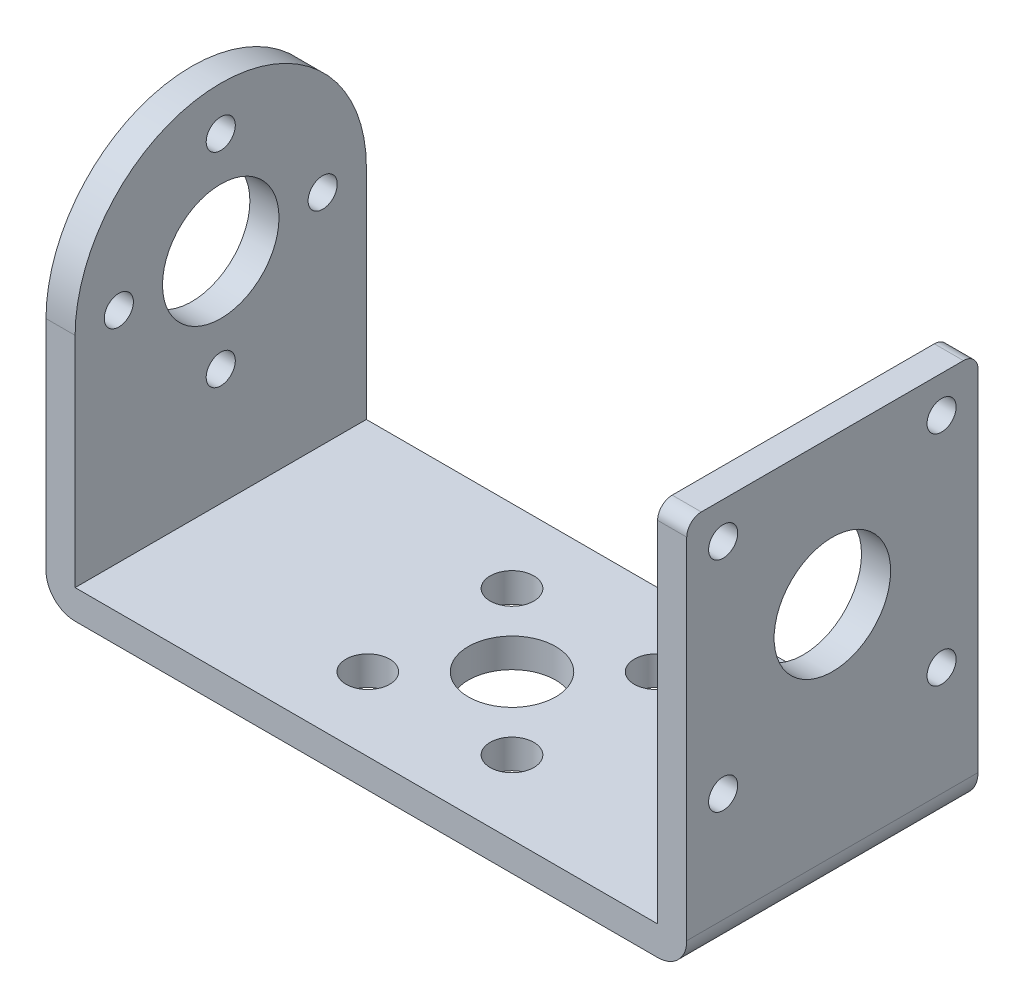
ISO-10303-21;
HEADER;
FILE_DESCRIPTION(('STEP AP214'),'2;1');
FILE_NAME('part.step','',(''),(''),'','','');
FILE_SCHEMA(('AUTOMOTIVE_DESIGN { 1 0 10303 214 1 1 1 1 }'));
ENDSEC;
DATA;
#1=APPLICATION_CONTEXT('core data for automotive mechanical design processes');
#2=APPLICATION_PROTOCOL_DEFINITION('international standard','automotive_design',2000,#1);
#3=PRODUCT_CONTEXT('',#1,'mechanical');
#4=PRODUCT('Part','Part','',(#3));
#5=PRODUCT_RELATED_PRODUCT_CATEGORY('part','',(#4));
#6=PRODUCT_DEFINITION_FORMATION('','',#4);
#7=PRODUCT_DEFINITION_CONTEXT('part definition',#1,'design');
#8=PRODUCT_DEFINITION('design','',#6,#7);
#9=PRODUCT_DEFINITION_SHAPE('','',#8);
#10=(LENGTH_UNIT() NAMED_UNIT(*) SI_UNIT(.MILLI.,.METRE.));
#11=(NAMED_UNIT(*) PLANE_ANGLE_UNIT() SI_UNIT($,.RADIAN.));
#12=(NAMED_UNIT(*) SI_UNIT($,.STERADIAN.) SOLID_ANGLE_UNIT());
#13=UNCERTAINTY_MEASURE_WITH_UNIT(LENGTH_MEASURE(1.E-05),#10,'distance_accuracy_value','');
#14=(GEOMETRIC_REPRESENTATION_CONTEXT(3) GLOBAL_UNCERTAINTY_ASSIGNED_CONTEXT((#13)) GLOBAL_UNIT_ASSIGNED_CONTEXT((#10,
#11,#12)) REPRESENTATION_CONTEXT('',''));
#15=CARTESIAN_POINT('',(0.,0.,0.));
#16=DIRECTION('',(0.,0.,1.));
#17=DIRECTION('',(1.,0.,0.));
#18=AXIS2_PLACEMENT_3D('',#15,#16,#17);
#19=CARTESIAN_POINT('',(20.,27.,-9.99999999999999));
#20=DIRECTION('',(1.,0.,0.));
#21=DIRECTION('',(0.,0.,-1.));
#22=AXIS2_PLACEMENT_3D('',#19,#20,#21);
#23=PLANE('',#22);
#24=CARTESIAN_POINT('',(20.,24.5,7.5));
#25=DIRECTION('',(1.,0.,0.));
#26=DIRECTION('',(0.,0.,-1.));
#27=AXIS2_PLACEMENT_3D('',#24,#25,#26);
#28=CIRCLE('',#27,1.);
#29=CARTESIAN_POINT('',(20.,24.5,6.5));
#30=VERTEX_POINT('',#29);
#31=EDGE_CURVE('E380',#30,#30,#28,.F.);
#32=ORIENTED_EDGE('',*,*,#31,.F.);
#33=EDGE_LOOP('',(#32));
#34=FACE_BOUND('',#33,.T.);
#35=CARTESIAN_POINT('',(20.,9.5,-7.5));
#36=DIRECTION('',(1.,0.,0.));
#37=DIRECTION('',(0.,0.,-1.));
#38=AXIS2_PLACEMENT_3D('',#35,#36,#37);
#39=CIRCLE('',#38,1.);
#40=CARTESIAN_POINT('',(20.,9.5,-8.5));
#41=VERTEX_POINT('',#40);
#42=EDGE_CURVE('E385',#41,#41,#39,.F.);
#43=ORIENTED_EDGE('',*,*,#42,.F.);
#44=EDGE_LOOP('',(#43));
#45=FACE_BOUND('',#44,.T.);
#46=CARTESIAN_POINT('',(20.,9.5,7.5));
#47=DIRECTION('',(1.,0.,0.));
#48=DIRECTION('',(0.,0.,-1.));
#49=AXIS2_PLACEMENT_3D('',#46,#47,#48);
#50=CIRCLE('',#49,1.);
#51=CARTESIAN_POINT('',(20.,9.5,6.5));
#52=VERTEX_POINT('',#51);
#53=EDGE_CURVE('E391',#52,#52,#50,.T.);
#54=ORIENTED_EDGE('',*,*,#53,.T.);
#55=EDGE_LOOP('',(#54));
#56=FACE_BOUND('',#55,.T.);
#57=CARTESIAN_POINT('',(20.,17.,0.));
#58=DIRECTION('',(1.,0.,0.));
#59=DIRECTION('',(0.,0.,-1.));
#60=AXIS2_PLACEMENT_3D('',#57,#58,#59);
#61=CIRCLE('',#60,4.);
#62=CARTESIAN_POINT('',(20.,17.,-4.));
#63=VERTEX_POINT('',#62);
#64=EDGE_CURVE('E394',#63,#63,#61,.F.);
#65=ORIENTED_EDGE('',*,*,#64,.F.);
#66=EDGE_LOOP('',(#65));
#67=FACE_BOUND('',#66,.T.);
#68=DIRECTION('',(0.,-1.,0.));
#69=VECTOR('',#68,1.);
#70=CARTESIAN_POINT('',(20.,27.,9.99999999999999));
#71=LINE('',#70,#69);
#72=CARTESIAN_POINT('',(20.,26.,9.99999999999999));
#73=VERTEX_POINT('',#72);
#74=CARTESIAN_POINT('',(20.,2.,9.99999999999999));
#75=VERTEX_POINT('',#74);
#76=EDGE_CURVE('E241',#73,#75,#71,.T.);
#77=ORIENTED_EDGE('',*,*,#76,.F.);
#78=CARTESIAN_POINT('',(20.,26.,9.00000000000001));
#79=DIRECTION('',(1.,0.,0.));
#80=DIRECTION('',(0.,0.,-1.));
#81=AXIS2_PLACEMENT_3D('',#78,#79,#80);
#82=CIRCLE('',#81,1.);
#83=CARTESIAN_POINT('',(20.,27.,9.00000000000001));
#84=VERTEX_POINT('',#83);
#85=EDGE_CURVE('E114',#73,#84,#82,.F.);
#86=ORIENTED_EDGE('',*,*,#85,.T.);
#87=DIRECTION('',(0.,0.,1.));
#88=VECTOR('',#87,1.);
#89=CARTESIAN_POINT('',(20.,27.,-9.99999999999999));
#90=LINE('',#89,#88);
#91=CARTESIAN_POINT('',(20.,27.,-8.99999999999999));
#92=VERTEX_POINT('',#91);
#93=EDGE_CURVE('E229',#92,#84,#90,.T.);
#94=ORIENTED_EDGE('',*,*,#93,.F.);
#95=CARTESIAN_POINT('',(20.,26.,-8.99999999999999));
#96=DIRECTION('',(1.,0.,0.));
#97=DIRECTION('',(0.,0.,-1.));
#98=AXIS2_PLACEMENT_3D('',#95,#96,#97);
#99=CIRCLE('',#98,1.);
#100=CARTESIAN_POINT('',(20.,26.,-9.99999999999999));
#101=VERTEX_POINT('',#100);
#102=EDGE_CURVE('E121',#92,#101,#99,.F.);
#103=ORIENTED_EDGE('',*,*,#102,.T.);
#104=DIRECTION('',(0.,-1.,0.));
#105=VECTOR('',#104,1.);
#106=CARTESIAN_POINT('',(20.,27.,-9.99999999999999));
#107=LINE('',#106,#105);
#108=CARTESIAN_POINT('',(20.,2.,-9.99999999999999));
#109=VERTEX_POINT('',#108);
#110=EDGE_CURVE('E235',#101,#109,#107,.T.);
#111=ORIENTED_EDGE('',*,*,#110,.T.);
#112=DIRECTION('',(0.,0.,-1.));
#113=VECTOR('',#112,1.);
#114=CARTESIAN_POINT('',(20.,2.,-9.99999999999999));
#115=LINE('',#114,#113);
#116=EDGE_CURVE('E274',#75,#109,#115,.T.);
#117=ORIENTED_EDGE('',*,*,#116,.F.);
#118=EDGE_LOOP('',(#77,#86,#94,#103,#111,#117));
#119=FACE_BOUND('',#118,.T.);
#120=CARTESIAN_POINT('',(20.,24.5,-7.5));
#121=DIRECTION('',(1.,0.,0.));
#122=DIRECTION('',(0.,0.,-1.));
#123=AXIS2_PLACEMENT_3D('',#120,#121,#122);
#124=CIRCLE('',#123,1.);
#125=CARTESIAN_POINT('',(20.,24.5,-8.5));
#126=VERTEX_POINT('',#125);
#127=EDGE_CURVE('E388',#126,#126,#124,.T.);
#128=ORIENTED_EDGE('',*,*,#127,.T.);
#129=EDGE_LOOP('',(#128));
#130=FACE_BOUND('',#129,.T.);
#131=ADVANCED_FACE('F106',(#34,#45,#56,#67,#119,#130),#23,.F.);
#132=CARTESIAN_POINT('',(22.,27.,-9.99999999999999));
#133=DIRECTION('',(-1.,0.,0.));
#134=DIRECTION('',(0.,0.,1.));
#135=AXIS2_PLACEMENT_3D('',#132,#133,#134);
#136=PLANE('',#135);
#137=CARTESIAN_POINT('',(22.,24.5,7.5));
#138=DIRECTION('',(1.,0.,0.));
#139=DIRECTION('',(0.,0.,-1.));
#140=AXIS2_PLACEMENT_3D('',#137,#138,#139);
#141=CIRCLE('',#140,1.);
#142=CARTESIAN_POINT('',(22.,24.5,6.5));
#143=VERTEX_POINT('',#142);
#144=EDGE_CURVE('E400',#143,#143,#141,.T.);
#145=ORIENTED_EDGE('',*,*,#144,.F.);
#146=EDGE_LOOP('',(#145));
#147=FACE_BOUND('',#146,.T.);
#148=CARTESIAN_POINT('',(22.,9.5,-7.5));
#149=DIRECTION('',(1.,0.,0.));
#150=DIRECTION('',(0.,0.,-1.));
#151=AXIS2_PLACEMENT_3D('',#148,#149,#150);
#152=CIRCLE('',#151,1.);
#153=CARTESIAN_POINT('',(22.,9.5,-8.5));
#154=VERTEX_POINT('',#153);
#155=EDGE_CURVE('E401',#154,#154,#152,.T.);
#156=ORIENTED_EDGE('',*,*,#155,.F.);
#157=EDGE_LOOP('',(#156));
#158=FACE_BOUND('',#157,.T.);
#159=CARTESIAN_POINT('',(22.,9.5,7.5));
#160=DIRECTION('',(-1.,0.,0.));
#161=DIRECTION('',(0.,0.,1.));
#162=AXIS2_PLACEMENT_3D('',#159,#160,#161);
#163=CIRCLE('',#162,1.);
#164=CARTESIAN_POINT('',(22.,9.5,8.5));
#165=VERTEX_POINT('',#164);
#166=EDGE_CURVE('E407',#165,#165,#163,.T.);
#167=ORIENTED_EDGE('',*,*,#166,.T.);
#168=EDGE_LOOP('',(#167));
#169=FACE_BOUND('',#168,.T.);
#170=CARTESIAN_POINT('',(22.,17.,0.));
#171=DIRECTION('',(1.,0.,0.));
#172=DIRECTION('',(0.,0.,-1.));
#173=AXIS2_PLACEMENT_3D('',#170,#171,#172);
#174=CIRCLE('',#173,4.);
#175=CARTESIAN_POINT('',(22.,17.,-4.));
#176=VERTEX_POINT('',#175);
#177=EDGE_CURVE('E397',#176,#176,#174,.T.);
#178=ORIENTED_EDGE('',*,*,#177,.F.);
#179=EDGE_LOOP('',(#178));
#180=FACE_BOUND('',#179,.T.);
#181=DIRECTION('',(0.,0.,-1.));
#182=VECTOR('',#181,1.);
#183=CARTESIAN_POINT('',(22.,27.,-9.99999999999999));
#184=LINE('',#183,#182);
#185=CARTESIAN_POINT('',(22.,27.,9.00000000000001));
#186=VERTEX_POINT('',#185);
#187=CARTESIAN_POINT('',(22.,27.,-9.));
#188=VERTEX_POINT('',#187);
#189=EDGE_CURVE('E232',#186,#188,#184,.T.);
#190=ORIENTED_EDGE('',*,*,#189,.F.);
#191=CARTESIAN_POINT('',(22.,26.,9.00000000000001));
#192=DIRECTION('',(-1.,0.,0.));
#193=DIRECTION('',(0.,0.,1.));
#194=AXIS2_PLACEMENT_3D('',#191,#192,#193);
#195=CIRCLE('',#194,1.);
#196=CARTESIAN_POINT('',(22.,26.,9.99999999999999));
#197=VERTEX_POINT('',#196);
#198=EDGE_CURVE('E316',#186,#197,#195,.F.);
#199=ORIENTED_EDGE('',*,*,#198,.T.);
#200=DIRECTION('',(0.,-1.,0.));
#201=VECTOR('',#200,1.);
#202=CARTESIAN_POINT('',(22.,27.,9.99999999999999));
#203=LINE('',#202,#201);
#204=CARTESIAN_POINT('',(22.,2.,9.99999999999999));
#205=VERTEX_POINT('',#204);
#206=EDGE_CURVE('E239',#197,#205,#203,.T.);
#207=ORIENTED_EDGE('',*,*,#206,.T.);
#208=DIRECTION('',(0.,0.,-1.));
#209=VECTOR('',#208,1.);
#210=CARTESIAN_POINT('',(22.,2.,-9.99999999999999));
#211=LINE('',#210,#209);
#212=CARTESIAN_POINT('',(22.,2.,-9.99999999999999));
#213=VERTEX_POINT('',#212);
#214=EDGE_CURVE('E305',#205,#213,#211,.T.);
#215=ORIENTED_EDGE('',*,*,#214,.T.);
#216=DIRECTION('',(0.,-1.,0.));
#217=VECTOR('',#216,1.);
#218=CARTESIAN_POINT('',(22.,27.,-9.99999999999999));
#219=LINE('',#218,#217);
#220=CARTESIAN_POINT('',(22.,26.,-9.99999999999999));
#221=VERTEX_POINT('',#220);
#222=EDGE_CURVE('E237',#221,#213,#219,.T.);
#223=ORIENTED_EDGE('',*,*,#222,.F.);
#224=CARTESIAN_POINT('',(22.,26.,-9.));
#225=DIRECTION('',(-1.,0.,0.));
#226=DIRECTION('',(0.,0.,1.));
#227=AXIS2_PLACEMENT_3D('',#224,#225,#226);
#228=CIRCLE('',#227,1.);
#229=EDGE_CURVE('E314',#221,#188,#228,.F.);
#230=ORIENTED_EDGE('',*,*,#229,.T.);
#231=EDGE_LOOP('',(#190,#199,#207,#215,#223,#230));
#232=FACE_BOUND('',#231,.T.);
#233=CARTESIAN_POINT('',(22.,24.5,-7.5));
#234=DIRECTION('',(-1.,0.,0.));
#235=DIRECTION('',(0.,0.,1.));
#236=AXIS2_PLACEMENT_3D('',#233,#234,#235);
#237=CIRCLE('',#236,1.);
#238=CARTESIAN_POINT('',(22.,24.5,-6.5));
#239=VERTEX_POINT('',#238);
#240=EDGE_CURVE('E404',#239,#239,#237,.T.);
#241=ORIENTED_EDGE('',*,*,#240,.T.);
#242=EDGE_LOOP('',(#241));
#243=FACE_BOUND('',#242,.T.);
#244=ADVANCED_FACE('F330',(#147,#158,#169,#180,#232,#243),#136,.F.);
#245=CARTESIAN_POINT('',(-20.,27.,-9.99999999999998));
#246=DIRECTION('',(-1.,0.,0.));
#247=DIRECTION('',(0.,0.,1.));
#248=AXIS2_PLACEMENT_3D('',#245,#246,#247);
#249=PLANE('',#248);
#250=CARTESIAN_POINT('',(-20.,17.,7.));
#251=DIRECTION('',(-1.,0.,0.));
#252=DIRECTION('',(0.,0.,1.));
#253=AXIS2_PLACEMENT_3D('',#250,#251,#252);
#254=CIRCLE('',#253,1.);
#255=CARTESIAN_POINT('',(-20.,17.,8.));
#256=VERTEX_POINT('',#255);
#257=EDGE_CURVE('E206',#256,#256,#254,.T.);
#258=ORIENTED_EDGE('',*,*,#257,.T.);
#259=EDGE_LOOP('',(#258));
#260=FACE_BOUND('',#259,.T.);
#261=CARTESIAN_POINT('',(-20.,24.,0.));
#262=DIRECTION('',(-1.,0.,0.));
#263=DIRECTION('',(0.,0.,1.));
#264=AXIS2_PLACEMENT_3D('',#261,#262,#263);
#265=CIRCLE('',#264,1.);
#266=CARTESIAN_POINT('',(-20.,24.,0.999999999999951));
#267=VERTEX_POINT('',#266);
#268=EDGE_CURVE('E357',#267,#267,#265,.T.);
#269=ORIENTED_EDGE('',*,*,#268,.T.);
#270=EDGE_LOOP('',(#269));
#271=FACE_BOUND('',#270,.T.);
#272=CARTESIAN_POINT('',(-20.,17.,0.));
#273=DIRECTION('',(-1.,0.,0.));
#274=DIRECTION('',(0.,0.,1.));
#275=AXIS2_PLACEMENT_3D('',#272,#273,#274);
#276=CIRCLE('',#275,4.);
#277=CARTESIAN_POINT('',(-20.,17.,4.));
#278=VERTEX_POINT('',#277);
#279=EDGE_CURVE('E360',#278,#278,#276,.T.);
#280=ORIENTED_EDGE('',*,*,#279,.T.);
#281=EDGE_LOOP('',(#280));
#282=FACE_BOUND('',#281,.T.);
#283=CARTESIAN_POINT('',(-20.,16.9999999999999,-7.));
#284=DIRECTION('',(-1.,0.,0.));
#285=DIRECTION('',(0.,0.,1.));
#286=AXIS2_PLACEMENT_3D('',#283,#284,#285);
#287=CIRCLE('',#286,1.);
#288=CARTESIAN_POINT('',(-20.,16.9999999999999,-6.));
#289=VERTEX_POINT('',#288);
#290=EDGE_CURVE('E213',#289,#289,#287,.T.);
#291=ORIENTED_EDGE('',*,*,#290,.T.);
#292=EDGE_LOOP('',(#291));
#293=FACE_BOUND('',#292,.T.);
#294=CARTESIAN_POINT('',(-20.,10.,0.));
#295=DIRECTION('',(-1.,0.,0.));
#296=DIRECTION('',(0.,0.,1.));
#297=AXIS2_PLACEMENT_3D('',#294,#295,#296);
#298=CIRCLE('',#297,1.);
#299=CARTESIAN_POINT('',(-20.,10.,1.));
#300=VERTEX_POINT('',#299);
#301=EDGE_CURVE('E363',#300,#300,#298,.T.);
#302=ORIENTED_EDGE('',*,*,#301,.T.);
#303=EDGE_LOOP('',(#302));
#304=FACE_BOUND('',#303,.T.);
#305=CARTESIAN_POINT('',(-20.,17.,0.));
#306=DIRECTION('',(-1.,0.,0.));
#307=DIRECTION('',(0.,0.,1.));
#308=AXIS2_PLACEMENT_3D('',#305,#306,#307);
#309=CIRCLE('',#308,10.);
#310=CARTESIAN_POINT('',(-20.,17.,10.));
#311=VERTEX_POINT('',#310);
#312=CARTESIAN_POINT('',(-20.,17.,-10.));
#313=VERTEX_POINT('',#312);
#314=EDGE_CURVE('E224',#311,#313,#309,.T.);
#315=ORIENTED_EDGE('',*,*,#314,.F.);
#316=DIRECTION('',(0.,-1.,0.));
#317=VECTOR('',#316,1.);
#318=CARTESIAN_POINT('',(-20.,27.,9.99999999999998));
#319=LINE('',#318,#317);
#320=CARTESIAN_POINT('',(-20.,2.,9.99999999999999));
#321=VERTEX_POINT('',#320);
#322=EDGE_CURVE('E212',#311,#321,#319,.T.);
#323=ORIENTED_EDGE('',*,*,#322,.T.);
#324=DIRECTION('',(0.,0.,1.));
#325=VECTOR('',#324,1.);
#326=CARTESIAN_POINT('',(-20.,2.,-9.99999999999998));
#327=LINE('',#326,#325);
#328=CARTESIAN_POINT('',(-20.,2.,-9.99999999999998));
#329=VERTEX_POINT('',#328);
#330=EDGE_CURVE('E281',#329,#321,#327,.T.);
#331=ORIENTED_EDGE('',*,*,#330,.F.);
#332=DIRECTION('',(0.,-1.,0.));
#333=VECTOR('',#332,1.);
#334=CARTESIAN_POINT('',(-20.,27.,-9.99999999999998));
#335=LINE('',#334,#333);
#336=EDGE_CURVE('E222',#313,#329,#335,.T.);
#337=ORIENTED_EDGE('',*,*,#336,.F.);
#338=EDGE_LOOP('',(#315,#323,#331,#337));
#339=FACE_BOUND('',#338,.T.);
#340=ADVANCED_FACE('F352',(#260,#271,#282,#293,#304,#339),#249,.F.);
#341=CARTESIAN_POINT('',(-22.,27.,-9.99999999999998));
#342=DIRECTION('',(1.,0.,0.));
#343=DIRECTION('',(0.,0.,-1.));
#344=AXIS2_PLACEMENT_3D('',#341,#342,#343);
#345=PLANE('',#344);
#346=CARTESIAN_POINT('',(-22.,17.,7.));
#347=DIRECTION('',(1.,0.,0.));
#348=DIRECTION('',(0.,0.,-1.));
#349=AXIS2_PLACEMENT_3D('',#346,#347,#348);
#350=CIRCLE('',#349,1.);
#351=CARTESIAN_POINT('',(-22.,17.,6.));
#352=VERTEX_POINT('',#351);
#353=EDGE_CURVE('E377',#352,#352,#350,.T.);
#354=ORIENTED_EDGE('',*,*,#353,.T.);
#355=EDGE_LOOP('',(#354));
#356=FACE_BOUND('',#355,.T.);
#357=CARTESIAN_POINT('',(-22.,24.,0.));
#358=DIRECTION('',(1.,0.,0.));
#359=DIRECTION('',(0.,0.,-1.));
#360=AXIS2_PLACEMENT_3D('',#357,#358,#359);
#361=CIRCLE('',#360,1.);
#362=CARTESIAN_POINT('',(-22.,24.,-1.00000000000005));
#363=VERTEX_POINT('',#362);
#364=EDGE_CURVE('E374',#363,#363,#361,.T.);
#365=ORIENTED_EDGE('',*,*,#364,.T.);
#366=EDGE_LOOP('',(#365));
#367=FACE_BOUND('',#366,.T.);
#368=CARTESIAN_POINT('',(-22.,17.,0.));
#369=DIRECTION('',(1.,0.,0.));
#370=DIRECTION('',(0.,0.,-1.));
#371=AXIS2_PLACEMENT_3D('',#368,#369,#370);
#372=CIRCLE('',#371,4.);
#373=CARTESIAN_POINT('',(-22.,17.,-4.));
#374=VERTEX_POINT('',#373);
#375=EDGE_CURVE('E214',#374,#374,#372,.T.);
#376=ORIENTED_EDGE('',*,*,#375,.T.);
#377=EDGE_LOOP('',(#376));
#378=FACE_BOUND('',#377,.T.);
#379=CARTESIAN_POINT('',(-22.,16.9999999999999,-7.));
#380=DIRECTION('',(1.,0.,0.));
#381=DIRECTION('',(0.,0.,-1.));
#382=AXIS2_PLACEMENT_3D('',#379,#380,#381);
#383=CIRCLE('',#382,1.);
#384=CARTESIAN_POINT('',(-22.,16.9999999999999,-8.));
#385=VERTEX_POINT('',#384);
#386=EDGE_CURVE('E371',#385,#385,#383,.T.);
#387=ORIENTED_EDGE('',*,*,#386,.T.);
#388=EDGE_LOOP('',(#387));
#389=FACE_BOUND('',#388,.T.);
#390=CARTESIAN_POINT('',(-22.,10.,0.));
#391=DIRECTION('',(1.,0.,0.));
#392=DIRECTION('',(0.,0.,-1.));
#393=AXIS2_PLACEMENT_3D('',#390,#391,#392);
#394=CIRCLE('',#393,1.);
#395=CARTESIAN_POINT('',(-22.,10.,-1.));
#396=VERTEX_POINT('',#395);
#397=EDGE_CURVE('E370',#396,#396,#394,.T.);
#398=ORIENTED_EDGE('',*,*,#397,.T.);
#399=EDGE_LOOP('',(#398));
#400=FACE_BOUND('',#399,.T.);
#401=DIRECTION('',(0.,-1.,0.));
#402=VECTOR('',#401,1.);
#403=CARTESIAN_POINT('',(-22.,27.,-9.99999999999998));
#404=LINE('',#403,#402);
#405=CARTESIAN_POINT('',(-22.,17.,-10.));
#406=VERTEX_POINT('',#405);
#407=CARTESIAN_POINT('',(-22.,2.,-9.99999999999998));
#408=VERTEX_POINT('',#407);
#409=EDGE_CURVE('E220',#406,#408,#404,.T.);
#410=ORIENTED_EDGE('',*,*,#409,.T.);
#411=DIRECTION('',(0.,0.,1.));
#412=VECTOR('',#411,1.);
#413=CARTESIAN_POINT('',(-22.,2.,-9.99999999999998));
#414=LINE('',#413,#412);
#415=CARTESIAN_POINT('',(-22.,2.,9.99999999999998));
#416=VERTEX_POINT('',#415);
#417=EDGE_CURVE('E219',#408,#416,#414,.T.);
#418=ORIENTED_EDGE('',*,*,#417,.T.);
#419=DIRECTION('',(0.,-1.,0.));
#420=VECTOR('',#419,1.);
#421=CARTESIAN_POINT('',(-22.,27.,9.99999999999998));
#422=LINE('',#421,#420);
#423=CARTESIAN_POINT('',(-22.,17.,10.));
#424=VERTEX_POINT('',#423);
#425=EDGE_CURVE('E210',#424,#416,#422,.T.);
#426=ORIENTED_EDGE('',*,*,#425,.F.);
#427=CARTESIAN_POINT('',(-22.,17.,0.));
#428=DIRECTION('',(1.,0.,0.));
#429=DIRECTION('',(0.,0.,-1.));
#430=AXIS2_PLACEMENT_3D('',#427,#428,#429);
#431=CIRCLE('',#430,10.);
#432=EDGE_CURVE('E195',#406,#424,#431,.T.);
#433=ORIENTED_EDGE('',*,*,#432,.F.);
#434=EDGE_LOOP('',(#410,#418,#426,#433));
#435=FACE_BOUND('',#434,.T.);
#436=ADVANCED_FACE('F217',(#356,#367,#378,#389,#400,#435),#345,.F.);
#437=CARTESIAN_POINT('',(-20.,2.,9.99999999999999));
#438=DIRECTION('',(0.,0.,-1.));
#439=DIRECTION('',(-1.,0.,0.));
#440=AXIS2_PLACEMENT_3D('',#437,#438,#439);
#441=PLANE('',#440);
#442=ORIENTED_EDGE('',*,*,#206,.F.);
#443=DIRECTION('',(1.,0.,0.));
#444=VECTOR('',#443,1.);
#445=CARTESIAN_POINT('',(20.,26.,10.));
#446=LINE('',#445,#444);
#447=EDGE_CURVE('E129',#197,#73,#446,.F.);
#448=ORIENTED_EDGE('',*,*,#447,.T.);
#449=ORIENTED_EDGE('',*,*,#76,.T.);
#450=DIRECTION('',(1.,0.,0.));
#451=VECTOR('',#450,1.);
#452=CARTESIAN_POINT('',(-20.,2.,9.99999999999999));
#453=LINE('',#452,#451);
#454=EDGE_CURVE('E284',#321,#75,#453,.T.);
#455=ORIENTED_EDGE('',*,*,#454,.F.);
#456=ORIENTED_EDGE('',*,*,#322,.F.);
#457=DIRECTION('',(1.,0.,0.));
#458=VECTOR('',#457,1.);
#459=CARTESIAN_POINT('',(-22.,17.,10.));
#460=LINE('',#459,#458);
#461=EDGE_CURVE('E198',#424,#311,#460,.T.);
#462=ORIENTED_EDGE('',*,*,#461,.F.);
#463=ORIENTED_EDGE('',*,*,#425,.T.);
#464=CARTESIAN_POINT('',(-20.,2.,9.99999999999999));
#465=DIRECTION('',(0.,0.,-1.));
#466=DIRECTION('',(-1.,0.,0.));
#467=AXIS2_PLACEMENT_3D('',#464,#465,#466);
#468=CIRCLE('',#467,2.);
#469=CARTESIAN_POINT('',(-20.,0.,9.99999999999999));
#470=VERTEX_POINT('',#469);
#471=EDGE_CURVE('E295',#416,#470,#468,.F.);
#472=ORIENTED_EDGE('',*,*,#471,.T.);
#473=DIRECTION('',(1.,0.,0.));
#474=VECTOR('',#473,1.);
#475=CARTESIAN_POINT('',(-20.,0.,9.99999999999999));
#476=LINE('',#475,#474);
#477=CARTESIAN_POINT('',(20.,0.,10.));
#478=VERTEX_POINT('',#477);
#479=EDGE_CURVE('E278',#470,#478,#476,.T.);
#480=ORIENTED_EDGE('',*,*,#479,.T.);
#481=CARTESIAN_POINT('',(20.,2.,10.));
#482=DIRECTION('',(0.,0.,-1.));
#483=DIRECTION('',(-1.,0.,0.));
#484=AXIS2_PLACEMENT_3D('',#481,#482,#483);
#485=CIRCLE('',#484,2.);
#486=EDGE_CURVE('E292',#478,#205,#485,.F.);
#487=ORIENTED_EDGE('',*,*,#486,.T.);
#488=EDGE_LOOP('',(#442,#448,#449,#455,#456,#462,#463,#472,#480,#487));
#489=FACE_BOUND('',#488,.T.);
#490=ADVANCED_FACE('F209',(#489),#441,.F.);
#491=CARTESIAN_POINT('',(0.,2.,0.));
#492=DIRECTION('',(0.,1.,0.));
#493=DIRECTION('',(0.,0.,1.));
#494=AXIS2_PLACEMENT_3D('',#491,#492,#493);
#495=PLANE('',#494);
#496=CARTESIAN_POINT('',(4.94974746830583,2.,-4.94974746830585));
#497=DIRECTION('',(0.,1.,0.));
#498=DIRECTION('',(0.,0.,1.));
#499=AXIS2_PLACEMENT_3D('',#496,#497,#498);
#500=CIRCLE('',#499,1.5);
#501=CARTESIAN_POINT('',(4.94974746830583,2.,-3.44974746830585));
#502=VERTEX_POINT('',#501);
#503=EDGE_CURVE('E250',#502,#502,#500,.T.);
#504=ORIENTED_EDGE('',*,*,#503,.F.);
#505=EDGE_LOOP('',(#504));
#506=FACE_BOUND('',#505,.T.);
#507=CARTESIAN_POINT('',(-4.94974746830583,2.,4.94974746830585));
#508=DIRECTION('',(0.,1.,0.));
#509=DIRECTION('',(0.,0.,1.));
#510=AXIS2_PLACEMENT_3D('',#507,#508,#509);
#511=CIRCLE('',#510,1.5);
#512=CARTESIAN_POINT('',(-4.94974746830583,2.,6.44974746830585));
#513=VERTEX_POINT('',#512);
#514=EDGE_CURVE('E262',#513,#513,#511,.T.);
#515=ORIENTED_EDGE('',*,*,#514,.F.);
#516=EDGE_LOOP('',(#515));
#517=FACE_BOUND('',#516,.T.);
#518=ORIENTED_EDGE('',*,*,#116,.T.);
#519=DIRECTION('',(-1.,0.,0.));
#520=VECTOR('',#519,1.);
#521=CARTESIAN_POINT('',(-20.,2.,-9.99999999999998));
#522=LINE('',#521,#520);
#523=EDGE_CURVE('E277',#109,#329,#522,.T.);
#524=ORIENTED_EDGE('',*,*,#523,.T.);
#525=ORIENTED_EDGE('',*,*,#330,.T.);
#526=ORIENTED_EDGE('',*,*,#454,.T.);
#527=EDGE_LOOP('',(#518,#524,#525,#526));
#528=FACE_BOUND('',#527,.T.);
#529=CARTESIAN_POINT('',(0.,2.,0.));
#530=DIRECTION('',(0.,1.,0.));
#531=DIRECTION('',(0.,0.,1.));
#532=AXIS2_PLACEMENT_3D('',#529,#530,#531);
#533=CIRCLE('',#532,3.);
#534=CARTESIAN_POINT('',(0.,2.,3.));
#535=VERTEX_POINT('',#534);
#536=EDGE_CURVE('E268',#535,#535,#533,.T.);
#537=ORIENTED_EDGE('',*,*,#536,.F.);
#538=EDGE_LOOP('',(#537));
#539=FACE_BOUND('',#538,.T.);
#540=CARTESIAN_POINT('',(-4.94974746830585,2.,-4.94974746830583));
#541=DIRECTION('',(0.,1.,0.));
#542=DIRECTION('',(0.,0.,1.));
#543=AXIS2_PLACEMENT_3D('',#540,#541,#542);
#544=CIRCLE('',#543,1.5);
#545=CARTESIAN_POINT('',(-4.94974746830585,2.,-3.44974746830583));
#546=VERTEX_POINT('',#545);
#547=EDGE_CURVE('E256',#546,#546,#544,.T.);
#548=ORIENTED_EDGE('',*,*,#547,.F.);
#549=EDGE_LOOP('',(#548));
#550=FACE_BOUND('',#549,.T.);
#551=CARTESIAN_POINT('',(4.94974746830585,2.,4.94974746830583));
#552=DIRECTION('',(0.,1.,0.));
#553=DIRECTION('',(0.,0.,1.));
#554=AXIS2_PLACEMENT_3D('',#551,#552,#553);
#555=CIRCLE('',#554,1.5);
#556=CARTESIAN_POINT('',(4.94974746830585,2.,6.44974746830583));
#557=VERTEX_POINT('',#556);
#558=EDGE_CURVE('E244',#557,#557,#555,.T.);
#559=ORIENTED_EDGE('',*,*,#558,.F.);
#560=EDGE_LOOP('',(#559));
#561=FACE_BOUND('',#560,.T.);
#562=ADVANCED_FACE('F347',(#506,#517,#528,#539,#550,#561),#495,.T.);
#563=CARTESIAN_POINT('',(0.,0.,0.));
#564=DIRECTION('',(0.,1.,0.));
#565=DIRECTION('',(0.,0.,1.));
#566=AXIS2_PLACEMENT_3D('',#563,#564,#565);
#567=PLANE('',#566);
#568=ORIENTED_EDGE('',*,*,#479,.F.);
#569=DIRECTION('',(0.,0.,1.));
#570=VECTOR('',#569,1.);
#571=CARTESIAN_POINT('',(-20.,0.,0.));
#572=LINE('',#571,#570);
#573=CARTESIAN_POINT('',(-20.,0.,-9.99999999999998));
#574=VERTEX_POINT('',#573);
#575=EDGE_CURVE('E299',#470,#574,#572,.F.);
#576=ORIENTED_EDGE('',*,*,#575,.T.);
#577=DIRECTION('',(-1.,0.,0.));
#578=VECTOR('',#577,1.);
#579=CARTESIAN_POINT('',(-20.,0.,-9.99999999999998));
#580=LINE('',#579,#578);
#581=CARTESIAN_POINT('',(20.,0.,-9.99999999999999));
#582=VERTEX_POINT('',#581);
#583=EDGE_CURVE('E271',#582,#574,#580,.T.);
#584=ORIENTED_EDGE('',*,*,#583,.F.);
#585=DIRECTION('',(0.,0.,-1.));
#586=VECTOR('',#585,1.);
#587=CARTESIAN_POINT('',(20.,0.,0.));
#588=LINE('',#587,#586);
#589=EDGE_CURVE('E297',#582,#478,#588,.F.);
#590=ORIENTED_EDGE('',*,*,#589,.T.);
#591=EDGE_LOOP('',(#568,#576,#584,#590));
#592=FACE_BOUND('',#591,.T.);
#593=CARTESIAN_POINT('',(0.,0.,0.));
#594=DIRECTION('',(0.,1.,0.));
#595=DIRECTION('',(0.,0.,1.));
#596=AXIS2_PLACEMENT_3D('',#593,#594,#595);
#597=CIRCLE('',#596,3.);
#598=CARTESIAN_POINT('',(0.,0.,3.));
#599=VERTEX_POINT('',#598);
#600=EDGE_CURVE('E265',#599,#599,#597,.T.);
#601=ORIENTED_EDGE('',*,*,#600,.T.);
#602=EDGE_LOOP('',(#601));
#603=FACE_BOUND('',#602,.T.);
#604=CARTESIAN_POINT('',(-4.94974746830583,0.,4.94974746830585));
#605=DIRECTION('',(0.,1.,0.));
#606=DIRECTION('',(0.,0.,1.));
#607=AXIS2_PLACEMENT_3D('',#604,#605,#606);
#608=CIRCLE('',#607,1.5);
#609=CARTESIAN_POINT('',(-4.94974746830583,0.,6.44974746830585));
#610=VERTEX_POINT('',#609);
#611=EDGE_CURVE('E259',#610,#610,#608,.T.);
#612=ORIENTED_EDGE('',*,*,#611,.T.);
#613=EDGE_LOOP('',(#612));
#614=FACE_BOUND('',#613,.T.);
#615=CARTESIAN_POINT('',(-4.94974746830585,0.,-4.94974746830583));
#616=DIRECTION('',(0.,1.,0.));
#617=DIRECTION('',(0.,0.,1.));
#618=AXIS2_PLACEMENT_3D('',#615,#616,#617);
#619=CIRCLE('',#618,1.5);
#620=CARTESIAN_POINT('',(-4.94974746830585,0.,-3.44974746830583));
#621=VERTEX_POINT('',#620);
#622=EDGE_CURVE('E253',#621,#621,#619,.T.);
#623=ORIENTED_EDGE('',*,*,#622,.T.);
#624=EDGE_LOOP('',(#623));
#625=FACE_BOUND('',#624,.T.);
#626=CARTESIAN_POINT('',(4.94974746830583,0.,-4.94974746830585));
#627=DIRECTION('',(0.,1.,0.));
#628=DIRECTION('',(0.,0.,1.));
#629=AXIS2_PLACEMENT_3D('',#626,#627,#628);
#630=CIRCLE('',#629,1.5);
#631=CARTESIAN_POINT('',(4.94974746830583,0.,-3.44974746830585));
#632=VERTEX_POINT('',#631);
#633=EDGE_CURVE('E247',#632,#632,#630,.T.);
#634=ORIENTED_EDGE('',*,*,#633,.T.);
#635=EDGE_LOOP('',(#634));
#636=FACE_BOUND('',#635,.T.);
#637=CARTESIAN_POINT('',(4.94974746830585,0.,4.94974746830583));
#638=DIRECTION('',(0.,1.,0.));
#639=DIRECTION('',(0.,0.,1.));
#640=AXIS2_PLACEMENT_3D('',#637,#638,#639);
#641=CIRCLE('',#640,1.5);
#642=CARTESIAN_POINT('',(4.94974746830585,0.,6.44974746830583));
#643=VERTEX_POINT('',#642);
#644=EDGE_CURVE('E243',#643,#643,#641,.T.);
#645=ORIENTED_EDGE('',*,*,#644,.T.);
#646=EDGE_LOOP('',(#645));
#647=FACE_BOUND('',#646,.T.);
#648=ADVANCED_FACE('F454',(#592,#603,#614,#625,#636,#647),#567,.F.);
#649=CARTESIAN_POINT('',(-20.,2.,-9.99999999999998));
#650=DIRECTION('',(0.,0.,1.));
#651=DIRECTION('',(1.,0.,0.));
#652=AXIS2_PLACEMENT_3D('',#649,#650,#651);
#653=PLANE('',#652);
#654=ORIENTED_EDGE('',*,*,#110,.F.);
#655=DIRECTION('',(-1.,0.,0.));
#656=VECTOR('',#655,1.);
#657=CARTESIAN_POINT('',(22.,26.,-9.99999999999999));
#658=LINE('',#657,#656);
#659=EDGE_CURVE('E12',#101,#221,#658,.F.);
#660=ORIENTED_EDGE('',*,*,#659,.T.);
#661=ORIENTED_EDGE('',*,*,#222,.T.);
#662=CARTESIAN_POINT('',(20.,2.,-9.99999999999999));
#663=DIRECTION('',(0.,0.,1.));
#664=DIRECTION('',(1.,0.,0.));
#665=AXIS2_PLACEMENT_3D('',#662,#663,#664);
#666=CIRCLE('',#665,2.);
#667=EDGE_CURVE('E301',#213,#582,#666,.F.);
#668=ORIENTED_EDGE('',*,*,#667,.T.);
#669=ORIENTED_EDGE('',*,*,#583,.T.);
#670=CARTESIAN_POINT('',(-20.,2.,-9.99999999999998));
#671=DIRECTION('',(0.,0.,1.));
#672=DIRECTION('',(1.,0.,0.));
#673=AXIS2_PLACEMENT_3D('',#670,#671,#672);
#674=CIRCLE('',#673,2.);
#675=EDGE_CURVE('E303',#574,#408,#674,.F.);
#676=ORIENTED_EDGE('',*,*,#675,.T.);
#677=ORIENTED_EDGE('',*,*,#409,.F.);
#678=DIRECTION('',(1.,0.,0.));
#679=VECTOR('',#678,1.);
#680=CARTESIAN_POINT('',(-22.,17.,-10.));
#681=LINE('',#680,#679);
#682=EDGE_CURVE('E201',#406,#313,#681,.T.);
#683=ORIENTED_EDGE('',*,*,#682,.T.);
#684=ORIENTED_EDGE('',*,*,#336,.T.);
#685=ORIENTED_EDGE('',*,*,#523,.F.);
#686=EDGE_LOOP('',(#654,#660,#661,#668,#669,#676,#677,#683,#684,#685));
#687=FACE_BOUND('',#686,.T.);
#688=ADVANCED_FACE('F344',(#687),#653,.F.);
#689=CARTESIAN_POINT('',(0.,2.,0.));
#690=DIRECTION('',(0.,-1.,0.));
#691=DIRECTION('',(0.,0.,-1.));
#692=AXIS2_PLACEMENT_3D('',#689,#690,#691);
#693=CYLINDRICAL_SURFACE('',#692,3.);
#694=ORIENTED_EDGE('',*,*,#536,.T.);
#695=EDGE_LOOP('',(#694));
#696=FACE_BOUND('',#695,.T.);
#697=ORIENTED_EDGE('',*,*,#600,.F.);
#698=EDGE_LOOP('',(#697));
#699=FACE_BOUND('',#698,.T.);
#700=ADVANCED_FACE('F447',(#696,#699),#693,.F.);
#701=CARTESIAN_POINT('',(-4.94974746830583,2.,4.94974746830585));
#702=DIRECTION('',(0.,-1.,0.));
#703=DIRECTION('',(0.,0.,-1.));
#704=AXIS2_PLACEMENT_3D('',#701,#702,#703);
#705=CYLINDRICAL_SURFACE('',#704,1.5);
#706=ORIENTED_EDGE('',*,*,#514,.T.);
#707=EDGE_LOOP('',(#706));
#708=FACE_BOUND('',#707,.T.);
#709=ORIENTED_EDGE('',*,*,#611,.F.);
#710=EDGE_LOOP('',(#709));
#711=FACE_BOUND('',#710,.T.);
#712=ADVANCED_FACE('F443',(#708,#711),#705,.F.);
#713=CARTESIAN_POINT('',(-4.94974746830585,2.,-4.94974746830583));
#714=DIRECTION('',(0.,-1.,0.));
#715=DIRECTION('',(0.,0.,-1.));
#716=AXIS2_PLACEMENT_3D('',#713,#714,#715);
#717=CYLINDRICAL_SURFACE('',#716,1.5);
#718=ORIENTED_EDGE('',*,*,#547,.T.);
#719=EDGE_LOOP('',(#718));
#720=FACE_BOUND('',#719,.T.);
#721=ORIENTED_EDGE('',*,*,#622,.F.);
#722=EDGE_LOOP('',(#721));
#723=FACE_BOUND('',#722,.T.);
#724=ADVANCED_FACE('F439',(#720,#723),#717,.F.);
#725=CARTESIAN_POINT('',(4.94974746830583,2.,-4.94974746830585));
#726=DIRECTION('',(0.,-1.,0.));
#727=DIRECTION('',(0.,0.,-1.));
#728=AXIS2_PLACEMENT_3D('',#725,#726,#727);
#729=CYLINDRICAL_SURFACE('',#728,1.5);
#730=ORIENTED_EDGE('',*,*,#503,.T.);
#731=EDGE_LOOP('',(#730));
#732=FACE_BOUND('',#731,.T.);
#733=ORIENTED_EDGE('',*,*,#633,.F.);
#734=EDGE_LOOP('',(#733));
#735=FACE_BOUND('',#734,.T.);
#736=ADVANCED_FACE('F435',(#732,#735),#729,.F.);
#737=CARTESIAN_POINT('',(4.94974746830585,2.,4.94974746830583));
#738=DIRECTION('',(0.,-1.,0.));
#739=DIRECTION('',(0.,0.,-1.));
#740=AXIS2_PLACEMENT_3D('',#737,#738,#739);
#741=CYLINDRICAL_SURFACE('',#740,1.5);
#742=ORIENTED_EDGE('',*,*,#558,.T.);
#743=EDGE_LOOP('',(#742));
#744=FACE_BOUND('',#743,.T.);
#745=ORIENTED_EDGE('',*,*,#644,.F.);
#746=EDGE_LOOP('',(#745));
#747=FACE_BOUND('',#746,.T.);
#748=ADVANCED_FACE('F432',(#744,#747),#741,.F.);
#749=CARTESIAN_POINT('',(0.,27.,0.));
#750=DIRECTION('',(0.,1.,0.));
#751=DIRECTION('',(0.,0.,1.));
#752=AXIS2_PLACEMENT_3D('',#749,#750,#751);
#753=PLANE('',#752);
#754=ORIENTED_EDGE('',*,*,#93,.T.);
#755=DIRECTION('',(1.,0.,0.));
#756=VECTOR('',#755,1.);
#757=CARTESIAN_POINT('',(22.,27.,9.00000000000001));
#758=LINE('',#757,#756);
#759=EDGE_CURVE('E311',#84,#186,#758,.T.);
#760=ORIENTED_EDGE('',*,*,#759,.T.);
#761=ORIENTED_EDGE('',*,*,#189,.T.);
#762=DIRECTION('',(-1.,0.,0.));
#763=VECTOR('',#762,1.);
#764=CARTESIAN_POINT('',(20.,27.,-8.99999999999999));
#765=LINE('',#764,#763);
#766=EDGE_CURVE('E308',#188,#92,#765,.T.);
#767=ORIENTED_EDGE('',*,*,#766,.T.);
#768=EDGE_LOOP('',(#754,#760,#761,#767));
#769=FACE_BOUND('',#768,.T.);
#770=ADVANCED_FACE('F325',(#769),#753,.T.);
#771=CARTESIAN_POINT('',(-22.,17.,0.));
#772=DIRECTION('',(1.,0.,0.));
#773=DIRECTION('',(0.,0.,-1.));
#774=AXIS2_PLACEMENT_3D('',#771,#772,#773);
#775=CYLINDRICAL_SURFACE('',#774,10.);
#776=ORIENTED_EDGE('',*,*,#314,.T.);
#777=ORIENTED_EDGE('',*,*,#682,.F.);
#778=ORIENTED_EDGE('',*,*,#432,.T.);
#779=ORIENTED_EDGE('',*,*,#461,.T.);
#780=EDGE_LOOP('',(#776,#777,#778,#779));
#781=FACE_BOUND('',#780,.T.);
#782=ADVANCED_FACE('F197',(#781),#775,.T.);
#783=CARTESIAN_POINT('',(-22.,16.9999999999999,-7.));
#784=DIRECTION('',(1.,0.,0.));
#785=DIRECTION('',(0.,0.,-1.));
#786=AXIS2_PLACEMENT_3D('',#783,#784,#785);
#787=CYLINDRICAL_SURFACE('',#786,1.);
#788=ORIENTED_EDGE('',*,*,#386,.F.);
#789=EDGE_LOOP('',(#788));
#790=FACE_BOUND('',#789,.T.);
#791=ORIENTED_EDGE('',*,*,#290,.F.);
#792=EDGE_LOOP('',(#791));
#793=FACE_BOUND('',#792,.T.);
#794=ADVANCED_FACE('F625',(#790,#793),#787,.F.);
#795=CARTESIAN_POINT('',(-22.,10.,0.));
#796=DIRECTION('',(1.,0.,0.));
#797=DIRECTION('',(0.,0.,-1.));
#798=AXIS2_PLACEMENT_3D('',#795,#796,#797);
#799=CYLINDRICAL_SURFACE('',#798,1.);
#800=ORIENTED_EDGE('',*,*,#397,.F.);
#801=EDGE_LOOP('',(#800));
#802=FACE_BOUND('',#801,.T.);
#803=ORIENTED_EDGE('',*,*,#301,.F.);
#804=EDGE_LOOP('',(#803));
#805=FACE_BOUND('',#804,.T.);
#806=ADVANCED_FACE('F615',(#802,#805),#799,.F.);
#807=CARTESIAN_POINT('',(-22.,17.,0.));
#808=DIRECTION('',(1.,0.,0.));
#809=DIRECTION('',(0.,0.,-1.));
#810=AXIS2_PLACEMENT_3D('',#807,#808,#809);
#811=CYLINDRICAL_SURFACE('',#810,4.);
#812=ORIENTED_EDGE('',*,*,#375,.F.);
#813=EDGE_LOOP('',(#812));
#814=FACE_BOUND('',#813,.T.);
#815=ORIENTED_EDGE('',*,*,#279,.F.);
#816=EDGE_LOOP('',(#815));
#817=FACE_BOUND('',#816,.T.);
#818=ADVANCED_FACE('F605',(#814,#817),#811,.F.);
#819=CARTESIAN_POINT('',(-22.,24.,0.));
#820=DIRECTION('',(1.,0.,0.));
#821=DIRECTION('',(0.,0.,-1.));
#822=AXIS2_PLACEMENT_3D('',#819,#820,#821);
#823=CYLINDRICAL_SURFACE('',#822,1.);
#824=ORIENTED_EDGE('',*,*,#364,.F.);
#825=EDGE_LOOP('',(#824));
#826=FACE_BOUND('',#825,.T.);
#827=ORIENTED_EDGE('',*,*,#268,.F.);
#828=EDGE_LOOP('',(#827));
#829=FACE_BOUND('',#828,.T.);
#830=ADVANCED_FACE('F595',(#826,#829),#823,.F.);
#831=CARTESIAN_POINT('',(-22.,17.,7.));
#832=DIRECTION('',(1.,0.,0.));
#833=DIRECTION('',(0.,0.,-1.));
#834=AXIS2_PLACEMENT_3D('',#831,#832,#833);
#835=CYLINDRICAL_SURFACE('',#834,1.);
#836=ORIENTED_EDGE('',*,*,#353,.F.);
#837=EDGE_LOOP('',(#836));
#838=FACE_BOUND('',#837,.T.);
#839=ORIENTED_EDGE('',*,*,#257,.F.);
#840=EDGE_LOOP('',(#839));
#841=FACE_BOUND('',#840,.T.);
#842=ADVANCED_FACE('F586',(#838,#841),#835,.F.);
#843=CARTESIAN_POINT('',(22.,17.,0.));
#844=DIRECTION('',(-1.,0.,0.));
#845=DIRECTION('',(0.,0.,1.));
#846=AXIS2_PLACEMENT_3D('',#843,#844,#845);
#847=CYLINDRICAL_SURFACE('',#846,4.);
#848=ORIENTED_EDGE('',*,*,#177,.T.);
#849=EDGE_LOOP('',(#848));
#850=FACE_BOUND('',#849,.T.);
#851=ORIENTED_EDGE('',*,*,#64,.T.);
#852=EDGE_LOOP('',(#851));
#853=FACE_BOUND('',#852,.T.);
#854=ADVANCED_FACE('F577',(#850,#853),#847,.F.);
#855=CARTESIAN_POINT('',(22.,9.5,7.5));
#856=DIRECTION('',(-1.,0.,0.));
#857=DIRECTION('',(0.,0.,1.));
#858=AXIS2_PLACEMENT_3D('',#855,#856,#857);
#859=CYLINDRICAL_SURFACE('',#858,1.);
#860=ORIENTED_EDGE('',*,*,#166,.F.);
#861=EDGE_LOOP('',(#860));
#862=FACE_BOUND('',#861,.T.);
#863=ORIENTED_EDGE('',*,*,#53,.F.);
#864=EDGE_LOOP('',(#863));
#865=FACE_BOUND('',#864,.T.);
#866=ADVANCED_FACE('F417',(#862,#865),#859,.F.);
#867=CARTESIAN_POINT('',(22.,24.5,-7.5));
#868=DIRECTION('',(-1.,0.,0.));
#869=DIRECTION('',(0.,0.,1.));
#870=AXIS2_PLACEMENT_3D('',#867,#868,#869);
#871=CYLINDRICAL_SURFACE('',#870,1.);
#872=ORIENTED_EDGE('',*,*,#240,.F.);
#873=EDGE_LOOP('',(#872));
#874=FACE_BOUND('',#873,.T.);
#875=ORIENTED_EDGE('',*,*,#127,.F.);
#876=EDGE_LOOP('',(#875));
#877=FACE_BOUND('',#876,.T.);
#878=ADVANCED_FACE('F413',(#874,#877),#871,.F.);
#879=CARTESIAN_POINT('',(22.,9.5,-7.5));
#880=DIRECTION('',(-1.,0.,0.));
#881=DIRECTION('',(0.,0.,1.));
#882=AXIS2_PLACEMENT_3D('',#879,#880,#881);
#883=CYLINDRICAL_SURFACE('',#882,1.);
#884=ORIENTED_EDGE('',*,*,#155,.T.);
#885=EDGE_LOOP('',(#884));
#886=FACE_BOUND('',#885,.T.);
#887=ORIENTED_EDGE('',*,*,#42,.T.);
#888=EDGE_LOOP('',(#887));
#889=FACE_BOUND('',#888,.T.);
#890=ADVANCED_FACE('F416',(#886,#889),#883,.F.);
#891=CARTESIAN_POINT('',(22.,24.5,7.5));
#892=DIRECTION('',(-1.,0.,0.));
#893=DIRECTION('',(0.,0.,1.));
#894=AXIS2_PLACEMENT_3D('',#891,#892,#893);
#895=CYLINDRICAL_SURFACE('',#894,1.);
#896=ORIENTED_EDGE('',*,*,#144,.T.);
#897=EDGE_LOOP('',(#896));
#898=FACE_BOUND('',#897,.T.);
#899=ORIENTED_EDGE('',*,*,#31,.T.);
#900=EDGE_LOOP('',(#899));
#901=FACE_BOUND('',#900,.T.);
#902=ADVANCED_FACE('F466',(#898,#901),#895,.F.);
#903=CARTESIAN_POINT('',(-20.,2.,-9.99999999999998));
#904=DIRECTION('',(0.,0.,1.));
#905=DIRECTION('',(1.,0.,0.));
#906=AXIS2_PLACEMENT_3D('',#903,#904,#905);
#907=CYLINDRICAL_SURFACE('',#906,2.);
#908=ORIENTED_EDGE('',*,*,#675,.F.);
#909=ORIENTED_EDGE('',*,*,#575,.F.);
#910=ORIENTED_EDGE('',*,*,#471,.F.);
#911=ORIENTED_EDGE('',*,*,#417,.F.);
#912=EDGE_LOOP('',(#908,#909,#910,#911));
#913=FACE_BOUND('',#912,.T.);
#914=ADVANCED_FACE('F463',(#913),#907,.T.);
#915=CARTESIAN_POINT('',(20.,2.,-9.99999999999999));
#916=DIRECTION('',(0.,0.,-1.));
#917=DIRECTION('',(-1.,0.,0.));
#918=AXIS2_PLACEMENT_3D('',#915,#916,#917);
#919=CYLINDRICAL_SURFACE('',#918,2.);
#920=ORIENTED_EDGE('',*,*,#486,.F.);
#921=ORIENTED_EDGE('',*,*,#589,.F.);
#922=ORIENTED_EDGE('',*,*,#667,.F.);
#923=ORIENTED_EDGE('',*,*,#214,.F.);
#924=EDGE_LOOP('',(#920,#921,#922,#923));
#925=FACE_BOUND('',#924,.T.);
#926=ADVANCED_FACE('F338',(#925),#919,.T.);
#927=CARTESIAN_POINT('',(0.,26.,9.));
#928=DIRECTION('',(-1.,0.,0.));
#929=DIRECTION('',(0.,0.,1.));
#930=AXIS2_PLACEMENT_3D('',#927,#928,#929);
#931=CYLINDRICAL_SURFACE('',#930,1.);
#932=ORIENTED_EDGE('',*,*,#85,.F.);
#933=ORIENTED_EDGE('',*,*,#447,.F.);
#934=ORIENTED_EDGE('',*,*,#198,.F.);
#935=ORIENTED_EDGE('',*,*,#759,.F.);
#936=EDGE_LOOP('',(#932,#933,#934,#935));
#937=FACE_BOUND('',#936,.T.);
#938=ADVANCED_FACE('F328',(#937),#931,.T.);
#939=CARTESIAN_POINT('',(0.,26.,-8.99999999999999));
#940=DIRECTION('',(1.,0.,0.));
#941=DIRECTION('',(0.,0.,-1.));
#942=AXIS2_PLACEMENT_3D('',#939,#940,#941);
#943=CYLINDRICAL_SURFACE('',#942,1.);
#944=ORIENTED_EDGE('',*,*,#229,.F.);
#945=ORIENTED_EDGE('',*,*,#659,.F.);
#946=ORIENTED_EDGE('',*,*,#102,.F.);
#947=ORIENTED_EDGE('',*,*,#766,.F.);
#948=EDGE_LOOP('',(#944,#945,#946,#947));
#949=FACE_BOUND('',#948,.T.);
#950=ADVANCED_FACE('F108',(#949),#943,.T.);
#951=CLOSED_SHELL('',(#131,#244,#340,#436,#490,#562,#648,#688,#700,#712,#724,#736,#748,#770,
#782,#794,#806,#818,#830,#842,#854,#866,#878,#890,#902,#914,#926,#938,#950));
#952=MANIFOLD_SOLID_BREP('B2',#951);
#953=ADVANCED_BREP_SHAPE_REPRESENTATION('',(#18,#952),#14);
#954=SHAPE_DEFINITION_REPRESENTATION(#9,#953);
ENDSEC;
END-ISO-10303-21;
